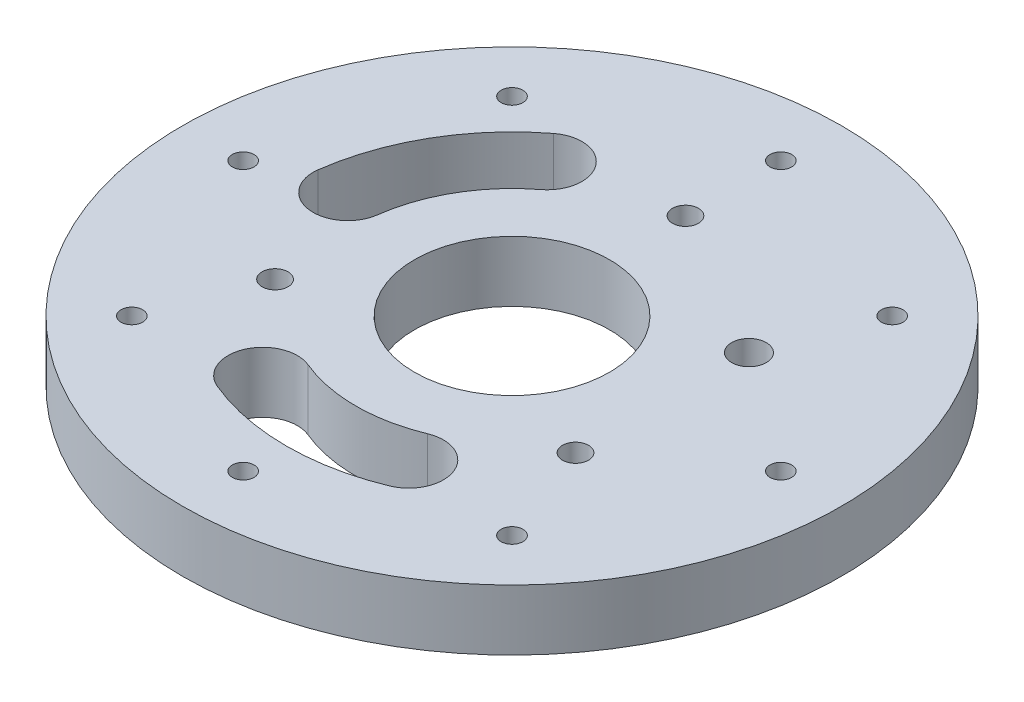
ISO-10303-21;
HEADER;
FILE_DESCRIPTION(('STEP AP214'),'2;1');
FILE_NAME('part.step','',(''),(''),'','','');
FILE_SCHEMA(('AUTOMOTIVE_DESIGN { 1 0 10303 214 1 1 1 1 }'));
ENDSEC;
DATA;
#1=APPLICATION_CONTEXT('core data for automotive mechanical design processes');
#2=APPLICATION_PROTOCOL_DEFINITION('international standard','automotive_design',2000,#1);
#3=PRODUCT_CONTEXT('',#1,'mechanical');
#4=PRODUCT('Part','Part','',(#3));
#5=PRODUCT_RELATED_PRODUCT_CATEGORY('part','',(#4));
#6=PRODUCT_DEFINITION_FORMATION('','',#4);
#7=PRODUCT_DEFINITION_CONTEXT('part definition',#1,'design');
#8=PRODUCT_DEFINITION('design','',#6,#7);
#9=PRODUCT_DEFINITION_SHAPE('','',#8);
#10=(LENGTH_UNIT() NAMED_UNIT(*) SI_UNIT(.MILLI.,.METRE.));
#11=(NAMED_UNIT(*) PLANE_ANGLE_UNIT() SI_UNIT($,.RADIAN.));
#12=(NAMED_UNIT(*) SI_UNIT($,.STERADIAN.) SOLID_ANGLE_UNIT());
#13=UNCERTAINTY_MEASURE_WITH_UNIT(LENGTH_MEASURE(1.E-05),#10,'distance_accuracy_value','');
#14=(GEOMETRIC_REPRESENTATION_CONTEXT(3) GLOBAL_UNCERTAINTY_ASSIGNED_CONTEXT((#13)) GLOBAL_UNIT_ASSIGNED_CONTEXT((#10,
#11,#12)) REPRESENTATION_CONTEXT('',''));
#15=CARTESIAN_POINT('',(0.,0.,0.));
#16=DIRECTION('',(0.,0.,1.));
#17=DIRECTION('',(1.,0.,0.));
#18=AXIS2_PLACEMENT_3D('',#15,#16,#17);
#19=CARTESIAN_POINT('',(0.,0.,0.));
#20=DIRECTION('',(0.,1.,0.));
#21=DIRECTION('',(0.,0.,1.));
#22=AXIS2_PLACEMENT_3D('',#19,#20,#21);
#23=PLANE('',#22);
#24=CARTESIAN_POINT('',(0.,0.,0.));
#25=DIRECTION('',(0.,1.,0.));
#26=DIRECTION('',(0.,0.,1.));
#27=AXIS2_PLACEMENT_3D('',#24,#25,#26);
#28=CIRCLE('',#27,11.25);
#29=CARTESIAN_POINT('',(0.,0.,11.25));
#30=VERTEX_POINT('',#29);
#31=EDGE_CURVE('E225',#30,#30,#28,.T.);
#32=ORIENTED_EDGE('',*,*,#31,.T.);
#33=EDGE_LOOP('',(#32));
#34=FACE_BOUND('',#33,.T.);
#35=CARTESIAN_POINT('',(0.,0.,0.));
#36=DIRECTION('',(0.,1.,0.));
#37=DIRECTION('',(0.,0.,1.));
#38=AXIS2_PLACEMENT_3D('',#35,#36,#37);
#39=CIRCLE('',#38,38.);
#40=CARTESIAN_POINT('',(0.,0.,38.));
#41=VERTEX_POINT('',#40);
#42=EDGE_CURVE('E12',#41,#41,#39,.T.);
#43=ORIENTED_EDGE('',*,*,#42,.F.);
#44=EDGE_LOOP('',(#43));
#45=FACE_BOUND('',#44,.T.);
#46=CARTESIAN_POINT('',(0.,0.,-20.));
#47=DIRECTION('',(0.,1.,0.));
#48=DIRECTION('',(0.,0.,1.));
#49=AXIS2_PLACEMENT_3D('',#46,#47,#48);
#50=CIRCLE('',#49,1.5);
#51=CARTESIAN_POINT('',(0.,0.,-18.5));
#52=VERTEX_POINT('',#51);
#53=EDGE_CURVE('E472',#52,#52,#50,.T.);
#54=ORIENTED_EDGE('',*,*,#53,.T.);
#55=EDGE_LOOP('',(#54));
#56=FACE_BOUND('',#55,.T.);
#57=CARTESIAN_POINT('',(17.3205080756887,0.,-10.0000000000001));
#58=DIRECTION('',(0.,1.,0.));
#59=DIRECTION('',(0.,0.,1.));
#60=AXIS2_PLACEMENT_3D('',#57,#58,#59);
#61=CIRCLE('',#60,2.);
#62=CARTESIAN_POINT('',(17.3205080756887,0.,-8.00000000000009));
#63=VERTEX_POINT('',#62);
#64=EDGE_CURVE('E470',#63,#63,#61,.T.);
#65=ORIENTED_EDGE('',*,*,#64,.T.);
#66=EDGE_LOOP('',(#65));
#67=FACE_BOUND('',#66,.T.);
#68=CARTESIAN_POINT('',(17.3205080756888,0.,9.99999999999999));
#69=DIRECTION('',(0.,1.,0.));
#70=DIRECTION('',(0.,0.,1.));
#71=AXIS2_PLACEMENT_3D('',#68,#69,#70);
#72=CIRCLE('',#71,1.5);
#73=CARTESIAN_POINT('',(17.3205080756888,0.,11.5));
#74=VERTEX_POINT('',#73);
#75=EDGE_CURVE('E462',#74,#74,#72,.T.);
#76=ORIENTED_EDGE('',*,*,#75,.T.);
#77=EDGE_LOOP('',(#76));
#78=FACE_BOUND('',#77,.T.);
#79=CARTESIAN_POINT('',(-17.3205080756888,0.,10.));
#80=DIRECTION('',(0.,1.,0.));
#81=DIRECTION('',(0.,0.,1.));
#82=AXIS2_PLACEMENT_3D('',#79,#80,#81);
#83=CIRCLE('',#82,1.5);
#84=CARTESIAN_POINT('',(-17.3205080756888,0.,11.5));
#85=VERTEX_POINT('',#84);
#86=EDGE_CURVE('E457',#85,#85,#83,.T.);
#87=ORIENTED_EDGE('',*,*,#86,.T.);
#88=EDGE_LOOP('',(#87));
#89=FACE_BOUND('',#88,.T.);
#90=CARTESIAN_POINT('',(21.920310216783,0.,21.920310216783));
#91=DIRECTION('',(0.,-1.,0.));
#92=DIRECTION('',(0.,0.,-1.));
#93=AXIS2_PLACEMENT_3D('',#90,#91,#92);
#94=CIRCLE('',#93,1.25);
#95=CARTESIAN_POINT('',(21.920310216783,0.,20.670310216783));
#96=VERTEX_POINT('',#95);
#97=EDGE_CURVE('E323',#96,#96,#94,.T.);
#98=ORIENTED_EDGE('',*,*,#97,.F.);
#99=EDGE_LOOP('',(#98));
#100=FACE_BOUND('',#99,.T.);
#101=CARTESIAN_POINT('',(31.,0.,0.));
#102=DIRECTION('',(0.,-1.,0.));
#103=DIRECTION('',(0.,0.,-1.));
#104=AXIS2_PLACEMENT_3D('',#101,#102,#103);
#105=CIRCLE('',#104,1.25);
#106=CARTESIAN_POINT('',(31.,0.,-1.25000000000001));
#107=VERTEX_POINT('',#106);
#108=EDGE_CURVE('E400',#107,#107,#105,.T.);
#109=ORIENTED_EDGE('',*,*,#108,.F.);
#110=EDGE_LOOP('',(#109));
#111=FACE_BOUND('',#110,.T.);
#112=CARTESIAN_POINT('',(21.920310216783,0.,-21.920310216783));
#113=DIRECTION('',(0.,-1.,0.));
#114=DIRECTION('',(0.,0.,-1.));
#115=AXIS2_PLACEMENT_3D('',#112,#113,#114);
#116=CIRCLE('',#115,1.25);
#117=CARTESIAN_POINT('',(21.920310216783,0.,-23.170310216783));
#118=VERTEX_POINT('',#117);
#119=EDGE_CURVE('E391',#118,#118,#116,.T.);
#120=ORIENTED_EDGE('',*,*,#119,.F.);
#121=EDGE_LOOP('',(#120));
#122=FACE_BOUND('',#121,.T.);
#123=CARTESIAN_POINT('',(0.,0.,-31.));
#124=DIRECTION('',(0.,-1.,0.));
#125=DIRECTION('',(0.,0.,-1.));
#126=AXIS2_PLACEMENT_3D('',#123,#124,#125);
#127=CIRCLE('',#126,1.25);
#128=CARTESIAN_POINT('',(0.,0.,-32.25));
#129=VERTEX_POINT('',#128);
#130=EDGE_CURVE('E388',#129,#129,#127,.T.);
#131=ORIENTED_EDGE('',*,*,#130,.F.);
#132=EDGE_LOOP('',(#131));
#133=FACE_BOUND('',#132,.T.);
#134=CARTESIAN_POINT('',(-21.920310216783,0.,-21.920310216783));
#135=DIRECTION('',(0.,-1.,0.));
#136=DIRECTION('',(0.,0.,-1.));
#137=AXIS2_PLACEMENT_3D('',#134,#135,#136);
#138=CIRCLE('',#137,1.25);
#139=CARTESIAN_POINT('',(-21.920310216783,0.,-23.170310216783));
#140=VERTEX_POINT('',#139);
#141=EDGE_CURVE('E387',#140,#140,#138,.T.);
#142=ORIENTED_EDGE('',*,*,#141,.F.);
#143=EDGE_LOOP('',(#142));
#144=FACE_BOUND('',#143,.T.);
#145=CARTESIAN_POINT('',(-31.,0.,0.));
#146=DIRECTION('',(0.,-1.,0.));
#147=DIRECTION('',(0.,0.,-1.));
#148=AXIS2_PLACEMENT_3D('',#145,#146,#147);
#149=CIRCLE('',#148,1.25);
#150=CARTESIAN_POINT('',(-31.,0.,-1.24999999999999));
#151=VERTEX_POINT('',#150);
#152=EDGE_CURVE('E385',#151,#151,#149,.T.);
#153=ORIENTED_EDGE('',*,*,#152,.F.);
#154=EDGE_LOOP('',(#153));
#155=FACE_BOUND('',#154,.T.);
#156=CARTESIAN_POINT('',(-21.920310216783,0.,21.920310216783));
#157=DIRECTION('',(0.,-1.,0.));
#158=DIRECTION('',(0.,0.,-1.));
#159=AXIS2_PLACEMENT_3D('',#156,#157,#158);
#160=CIRCLE('',#159,1.25);
#161=CARTESIAN_POINT('',(-21.920310216783,0.,20.670310216783));
#162=VERTEX_POINT('',#161);
#163=EDGE_CURVE('E377',#162,#162,#160,.T.);
#164=ORIENTED_EDGE('',*,*,#163,.F.);
#165=EDGE_LOOP('',(#164));
#166=FACE_BOUND('',#165,.T.);
#167=CARTESIAN_POINT('',(0.,0.,31.));
#168=DIRECTION('',(0.,-1.,0.));
#169=DIRECTION('',(0.,0.,-1.));
#170=AXIS2_PLACEMENT_3D('',#167,#168,#169);
#171=CIRCLE('',#170,1.25);
#172=CARTESIAN_POINT('',(0.,0.,29.75));
#173=VERTEX_POINT('',#172);
#174=EDGE_CURVE('E373',#173,#173,#171,.T.);
#175=ORIENTED_EDGE('',*,*,#174,.F.);
#176=EDGE_LOOP('',(#175));
#177=FACE_BOUND('',#176,.T.);
#178=CARTESIAN_POINT('',(0.,0.,0.));
#179=DIRECTION('',(0.,1.,0.));
#180=DIRECTION('',(0.,0.,1.));
#181=AXIS2_PLACEMENT_3D('',#178,#179,#180);
#182=CIRCLE('',#181,18.);
#183=CARTESIAN_POINT('',(-10.957705722157,0.,-14.2803601252422));
#184=VERTEX_POINT('',#183);
#185=CARTESIAN_POINT('',(-17.8460075047286,0.,-2.34947145996091));
#186=VERTEX_POINT('',#185);
#187=EDGE_CURVE('E352',#184,#186,#182,.T.);
#188=ORIENTED_EDGE('',*,*,#187,.F.);
#189=CARTESIAN_POINT('',(-13.3927514381919,0.,-17.4537734864072));
#190=DIRECTION('',(0.,-1.,0.));
#191=DIRECTION('',(0.,0.,1.));
#192=AXIS2_PLACEMENT_3D('',#189,#190,#191);
#193=CIRCLE('',#192,4.);
#194=CARTESIAN_POINT('',(-15.8277971542267,0.,-20.6271868475721));
#195=VERTEX_POINT('',#194);
#196=EDGE_CURVE('E240',#195,#184,#193,.T.);
#197=ORIENTED_EDGE('',*,*,#196,.F.);
#198=CARTESIAN_POINT('',(0.,0.,0.));
#199=DIRECTION('',(0.,-1.,0.));
#200=DIRECTION('',(0.,0.,1.));
#201=AXIS2_PLACEMENT_3D('',#198,#199,#200);
#202=CIRCLE('',#201,26.);
#203=CARTESIAN_POINT('',(-25.7775663957191,0.,-3.39368099772132));
#204=VERTEX_POINT('',#203);
#205=EDGE_CURVE('E341',#204,#195,#202,.T.);
#206=ORIENTED_EDGE('',*,*,#205,.F.);
#207=CARTESIAN_POINT('',(-21.8117869502238,0.,-2.87157622884111));
#208=DIRECTION('',(0.,-1.,0.));
#209=DIRECTION('',(0.,0.,1.));
#210=AXIS2_PLACEMENT_3D('',#207,#208,#209);
#211=CIRCLE('',#210,4.);
#212=EDGE_CURVE('E346',#186,#204,#211,.T.);
#213=ORIENTED_EDGE('',*,*,#212,.F.);
#214=EDGE_LOOP('',(#188,#197,#206,#213));
#215=FACE_BOUND('',#214,.T.);
#216=CARTESIAN_POINT('',(0.,0.,0.));
#217=DIRECTION('',(0.,-1.,0.));
#218=DIRECTION('',(0.,0.,-1.));
#219=AXIS2_PLACEMENT_3D('',#216,#217,#218);
#220=CIRCLE('',#219,26.);
#221=CARTESIAN_POINT('',(9.94976924149235,0.,24.0208678452935));
#222=VERTEX_POINT('',#221);
#223=CARTESIAN_POINT('',(-9.94976924149234,0.,24.0208678452935));
#224=VERTEX_POINT('',#223);
#225=EDGE_CURVE('E317',#222,#224,#220,.T.);
#226=ORIENTED_EDGE('',*,*,#225,.F.);
#227=CARTESIAN_POINT('',(8.41903551203199,0.,20.3253497152483));
#228=DIRECTION('',(0.,-1.,0.));
#229=DIRECTION('',(0.,0.,-1.));
#230=AXIS2_PLACEMENT_3D('',#227,#228,#229);
#231=CIRCLE('',#230,4.);
#232=CARTESIAN_POINT('',(6.88830178257163,0.,16.6298315852032));
#233=VERTEX_POINT('',#232);
#234=EDGE_CURVE('E230',#233,#222,#231,.T.);
#235=ORIENTED_EDGE('',*,*,#234,.F.);
#236=CARTESIAN_POINT('',(0.,0.,0.));
#237=DIRECTION('',(0.,1.,0.));
#238=DIRECTION('',(0.,0.,-1.));
#239=AXIS2_PLACEMENT_3D('',#236,#237,#238);
#240=CIRCLE('',#239,18.);
#241=CARTESIAN_POINT('',(-6.88830178257163,0.,16.6298315852032));
#242=VERTEX_POINT('',#241);
#243=EDGE_CURVE('E305',#242,#233,#240,.T.);
#244=ORIENTED_EDGE('',*,*,#243,.F.);
#245=CARTESIAN_POINT('',(-8.41903551203199,0.,20.3253497152483));
#246=DIRECTION('',(0.,-1.,0.));
#247=DIRECTION('',(0.,0.,-1.));
#248=AXIS2_PLACEMENT_3D('',#245,#246,#247);
#249=CIRCLE('',#248,4.);
#250=EDGE_CURVE('E308',#224,#242,#249,.T.);
#251=ORIENTED_EDGE('',*,*,#250,.F.);
#252=EDGE_LOOP('',(#226,#235,#244,#251));
#253=FACE_BOUND('',#252,.T.);
#254=ADVANCED_FACE('F214',(#34,#45,#56,#67,#78,#89,#100,#111,#122,#133,#144,#155,#166,#177,#215,
#253),#23,.F.);
#255=CARTESIAN_POINT('',(0.,7.,0.));
#256=DIRECTION('',(0.,1.,0.));
#257=DIRECTION('',(0.,0.,1.));
#258=AXIS2_PLACEMENT_3D('',#255,#256,#257);
#259=PLANE('',#258);
#260=CARTESIAN_POINT('',(-13.3927514381919,7.,-17.4537734864072));
#261=DIRECTION('',(0.,-1.,0.));
#262=DIRECTION('',(0.,0.,1.));
#263=AXIS2_PLACEMENT_3D('',#260,#261,#262);
#264=CIRCLE('',#263,4.);
#265=CARTESIAN_POINT('',(-15.8277971542267,7.,-20.6271868475721));
#266=VERTEX_POINT('',#265);
#267=CARTESIAN_POINT('',(-10.957705722157,7.,-14.2803601252422));
#268=VERTEX_POINT('',#267);
#269=EDGE_CURVE('E347',#266,#268,#264,.T.);
#270=ORIENTED_EDGE('',*,*,#269,.T.);
#271=CARTESIAN_POINT('',(0.,7.,0.));
#272=DIRECTION('',(0.,1.,0.));
#273=DIRECTION('',(0.,0.,1.));
#274=AXIS2_PLACEMENT_3D('',#271,#272,#273);
#275=CIRCLE('',#274,18.);
#276=CARTESIAN_POINT('',(-17.8460075047286,7.,-2.34947145996091));
#277=VERTEX_POINT('',#276);
#278=EDGE_CURVE('E366',#268,#277,#275,.T.);
#279=ORIENTED_EDGE('',*,*,#278,.T.);
#280=CARTESIAN_POINT('',(-21.8117869502238,7.,-2.87157622884111));
#281=DIRECTION('',(0.,-1.,0.));
#282=DIRECTION('',(0.,0.,1.));
#283=AXIS2_PLACEMENT_3D('',#280,#281,#282);
#284=CIRCLE('',#283,4.);
#285=CARTESIAN_POINT('',(-25.7775663957191,7.,-3.39368099772132));
#286=VERTEX_POINT('',#285);
#287=EDGE_CURVE('E365',#277,#286,#284,.T.);
#288=ORIENTED_EDGE('',*,*,#287,.T.);
#289=CARTESIAN_POINT('',(0.,7.,0.));
#290=DIRECTION('',(0.,-1.,0.));
#291=DIRECTION('',(0.,0.,1.));
#292=AXIS2_PLACEMENT_3D('',#289,#290,#291);
#293=CIRCLE('',#292,26.);
#294=EDGE_CURVE('E333',#286,#266,#293,.T.);
#295=ORIENTED_EDGE('',*,*,#294,.T.);
#296=EDGE_LOOP('',(#270,#279,#288,#295));
#297=FACE_BOUND('',#296,.T.);
#298=CARTESIAN_POINT('',(-31.,7.,0.));
#299=DIRECTION('',(0.,1.,0.));
#300=DIRECTION('',(0.,0.,1.));
#301=AXIS2_PLACEMENT_3D('',#298,#299,#300);
#302=CIRCLE('',#301,1.25);
#303=CARTESIAN_POINT('',(-31.,7.,1.25000000000001));
#304=VERTEX_POINT('',#303);
#305=EDGE_CURVE('E410',#304,#304,#302,.T.);
#306=ORIENTED_EDGE('',*,*,#305,.F.);
#307=EDGE_LOOP('',(#306));
#308=FACE_BOUND('',#307,.T.);
#309=CARTESIAN_POINT('',(0.,7.,31.));
#310=DIRECTION('',(0.,1.,0.));
#311=DIRECTION('',(0.,0.,1.));
#312=AXIS2_PLACEMENT_3D('',#309,#310,#311);
#313=CIRCLE('',#312,1.25);
#314=CARTESIAN_POINT('',(0.,7.,32.25));
#315=VERTEX_POINT('',#314);
#316=EDGE_CURVE('E414',#315,#315,#313,.T.);
#317=ORIENTED_EDGE('',*,*,#316,.F.);
#318=EDGE_LOOP('',(#317));
#319=FACE_BOUND('',#318,.T.);
#320=CARTESIAN_POINT('',(31.,7.,0.));
#321=DIRECTION('',(0.,1.,0.));
#322=DIRECTION('',(0.,0.,1.));
#323=AXIS2_PLACEMENT_3D('',#320,#321,#322);
#324=CIRCLE('',#323,1.25);
#325=CARTESIAN_POINT('',(31.,7.,1.25));
#326=VERTEX_POINT('',#325);
#327=EDGE_CURVE('E421',#326,#326,#324,.T.);
#328=ORIENTED_EDGE('',*,*,#327,.F.);
#329=EDGE_LOOP('',(#328));
#330=FACE_BOUND('',#329,.T.);
#331=CARTESIAN_POINT('',(0.,7.,-31.));
#332=DIRECTION('',(0.,1.,0.));
#333=DIRECTION('',(0.,0.,1.));
#334=AXIS2_PLACEMENT_3D('',#331,#332,#333);
#335=CIRCLE('',#334,1.25);
#336=CARTESIAN_POINT('',(0.,7.,-29.75));
#337=VERTEX_POINT('',#336);
#338=EDGE_CURVE('E431',#337,#337,#335,.T.);
#339=ORIENTED_EDGE('',*,*,#338,.F.);
#340=EDGE_LOOP('',(#339));
#341=FACE_BOUND('',#340,.T.);
#342=CARTESIAN_POINT('',(-17.3205080756888,7.,10.));
#343=DIRECTION('',(0.,1.,0.));
#344=DIRECTION('',(0.,0.,1.));
#345=AXIS2_PLACEMENT_3D('',#342,#343,#344);
#346=CIRCLE('',#345,1.5);
#347=CARTESIAN_POINT('',(-17.3205080756888,7.,11.5));
#348=VERTEX_POINT('',#347);
#349=EDGE_CURVE('E437',#348,#348,#346,.T.);
#350=ORIENTED_EDGE('',*,*,#349,.F.);
#351=EDGE_LOOP('',(#350));
#352=FACE_BOUND('',#351,.T.);
#353=CARTESIAN_POINT('',(17.3205080756887,7.,-10.0000000000001));
#354=DIRECTION('',(0.,1.,0.));
#355=DIRECTION('',(0.,0.,1.));
#356=AXIS2_PLACEMENT_3D('',#353,#354,#355);
#357=CIRCLE('',#356,2.);
#358=CARTESIAN_POINT('',(17.3205080756887,7.,-8.00000000000009));
#359=VERTEX_POINT('',#358);
#360=EDGE_CURVE('E450',#359,#359,#357,.T.);
#361=ORIENTED_EDGE('',*,*,#360,.F.);
#362=EDGE_LOOP('',(#361));
#363=FACE_BOUND('',#362,.T.);
#364=CARTESIAN_POINT('',(0.,7.,0.));
#365=DIRECTION('',(0.,1.,0.));
#366=DIRECTION('',(0.,0.,1.));
#367=AXIS2_PLACEMENT_3D('',#364,#365,#366);
#368=CIRCLE('',#367,38.);
#369=CARTESIAN_POINT('',(0.,7.,38.));
#370=VERTEX_POINT('',#369);
#371=EDGE_CURVE('E453',#370,#370,#368,.T.);
#372=ORIENTED_EDGE('',*,*,#371,.T.);
#373=EDGE_LOOP('',(#372));
#374=FACE_BOUND('',#373,.T.);
#375=CARTESIAN_POINT('',(0.,7.,0.));
#376=DIRECTION('',(0.,1.,0.));
#377=DIRECTION('',(0.,0.,1.));
#378=AXIS2_PLACEMENT_3D('',#375,#376,#377);
#379=CIRCLE('',#378,11.25);
#380=CARTESIAN_POINT('',(0.,7.,11.25));
#381=VERTEX_POINT('',#380);
#382=EDGE_CURVE('E452',#381,#381,#379,.T.);
#383=ORIENTED_EDGE('',*,*,#382,.F.);
#384=EDGE_LOOP('',(#383));
#385=FACE_BOUND('',#384,.T.);
#386=CARTESIAN_POINT('',(17.3205080756888,7.,9.99999999999999));
#387=DIRECTION('',(0.,1.,0.));
#388=DIRECTION('',(0.,0.,1.));
#389=AXIS2_PLACEMENT_3D('',#386,#387,#388);
#390=CIRCLE('',#389,1.5);
#391=CARTESIAN_POINT('',(17.3205080756888,7.,11.5));
#392=VERTEX_POINT('',#391);
#393=EDGE_CURVE('E442',#392,#392,#390,.T.);
#394=ORIENTED_EDGE('',*,*,#393,.F.);
#395=EDGE_LOOP('',(#394));
#396=FACE_BOUND('',#395,.T.);
#397=CARTESIAN_POINT('',(0.,7.,-20.));
#398=DIRECTION('',(0.,1.,0.));
#399=DIRECTION('',(0.,0.,1.));
#400=AXIS2_PLACEMENT_3D('',#397,#398,#399);
#401=CIRCLE('',#400,1.5);
#402=CARTESIAN_POINT('',(0.,7.,-18.5));
#403=VERTEX_POINT('',#402);
#404=EDGE_CURVE('E434',#403,#403,#401,.T.);
#405=ORIENTED_EDGE('',*,*,#404,.F.);
#406=EDGE_LOOP('',(#405));
#407=FACE_BOUND('',#406,.T.);
#408=CARTESIAN_POINT('',(21.920310216783,7.,-21.920310216783));
#409=DIRECTION('',(0.,1.,0.));
#410=DIRECTION('',(0.,0.,1.));
#411=AXIS2_PLACEMENT_3D('',#408,#409,#410);
#412=CIRCLE('',#411,1.25);
#413=CARTESIAN_POINT('',(21.920310216783,7.,-20.670310216783));
#414=VERTEX_POINT('',#413);
#415=EDGE_CURVE('E430',#414,#414,#412,.T.);
#416=ORIENTED_EDGE('',*,*,#415,.F.);
#417=EDGE_LOOP('',(#416));
#418=FACE_BOUND('',#417,.T.);
#419=CARTESIAN_POINT('',(21.920310216783,7.,21.920310216783));
#420=DIRECTION('',(0.,1.,0.));
#421=DIRECTION('',(0.,0.,1.));
#422=AXIS2_PLACEMENT_3D('',#419,#420,#421);
#423=CIRCLE('',#422,1.25);
#424=CARTESIAN_POINT('',(21.920310216783,7.,23.170310216783));
#425=VERTEX_POINT('',#424);
#426=EDGE_CURVE('E418',#425,#425,#423,.T.);
#427=ORIENTED_EDGE('',*,*,#426,.F.);
#428=EDGE_LOOP('',(#427));
#429=FACE_BOUND('',#428,.T.);
#430=CARTESIAN_POINT('',(-21.920310216783,7.,21.920310216783));
#431=DIRECTION('',(0.,1.,0.));
#432=DIRECTION('',(0.,0.,1.));
#433=AXIS2_PLACEMENT_3D('',#430,#431,#432);
#434=CIRCLE('',#433,1.25);
#435=CARTESIAN_POINT('',(-21.920310216783,7.,23.170310216783));
#436=VERTEX_POINT('',#435);
#437=EDGE_CURVE('E413',#436,#436,#434,.T.);
#438=ORIENTED_EDGE('',*,*,#437,.F.);
#439=EDGE_LOOP('',(#438));
#440=FACE_BOUND('',#439,.T.);
#441=CARTESIAN_POINT('',(-21.920310216783,7.,-21.920310216783));
#442=DIRECTION('',(0.,1.,0.));
#443=DIRECTION('',(0.,0.,1.));
#444=AXIS2_PLACEMENT_3D('',#441,#442,#443);
#445=CIRCLE('',#444,1.25);
#446=CARTESIAN_POINT('',(-21.920310216783,7.,-20.670310216783));
#447=VERTEX_POINT('',#446);
#448=EDGE_CURVE('E380',#447,#447,#445,.T.);
#449=ORIENTED_EDGE('',*,*,#448,.F.);
#450=EDGE_LOOP('',(#449));
#451=FACE_BOUND('',#450,.T.);
#452=CARTESIAN_POINT('',(8.41903551203199,7.,20.3253497152483));
#453=DIRECTION('',(0.,-1.,0.));
#454=DIRECTION('',(0.,0.,-1.));
#455=AXIS2_PLACEMENT_3D('',#452,#453,#454);
#456=CIRCLE('',#455,4.);
#457=CARTESIAN_POINT('',(6.88830178257163,7.,16.6298315852032));
#458=VERTEX_POINT('',#457);
#459=CARTESIAN_POINT('',(9.94976924149235,7.,24.0208678452935));
#460=VERTEX_POINT('',#459);
#461=EDGE_CURVE('E283',#458,#460,#456,.T.);
#462=ORIENTED_EDGE('',*,*,#461,.T.);
#463=CARTESIAN_POINT('',(0.,7.,0.));
#464=DIRECTION('',(0.,-1.,0.));
#465=DIRECTION('',(0.,0.,-1.));
#466=AXIS2_PLACEMENT_3D('',#463,#464,#465);
#467=CIRCLE('',#466,26.);
#468=CARTESIAN_POINT('',(-9.94976924149234,7.,24.0208678452935));
#469=VERTEX_POINT('',#468);
#470=EDGE_CURVE('E292',#460,#469,#467,.T.);
#471=ORIENTED_EDGE('',*,*,#470,.T.);
#472=CARTESIAN_POINT('',(-8.41903551203199,7.,20.3253497152483));
#473=DIRECTION('',(0.,-1.,0.));
#474=DIRECTION('',(0.,0.,-1.));
#475=AXIS2_PLACEMENT_3D('',#472,#473,#474);
#476=CIRCLE('',#475,4.);
#477=CARTESIAN_POINT('',(-6.88830178257163,7.,16.6298315852032));
#478=VERTEX_POINT('',#477);
#479=EDGE_CURVE('E300',#469,#478,#476,.T.);
#480=ORIENTED_EDGE('',*,*,#479,.T.);
#481=CARTESIAN_POINT('',(0.,7.,0.));
#482=DIRECTION('',(0.,1.,0.));
#483=DIRECTION('',(0.,0.,-1.));
#484=AXIS2_PLACEMENT_3D('',#481,#482,#483);
#485=CIRCLE('',#484,18.);
#486=EDGE_CURVE('E287',#478,#458,#485,.T.);
#487=ORIENTED_EDGE('',*,*,#486,.T.);
#488=EDGE_LOOP('',(#462,#471,#480,#487));
#489=FACE_BOUND('',#488,.T.);
#490=ADVANCED_FACE('F299',(#297,#308,#319,#330,#341,#352,#363,#374,#385,#396,#407,#418,#429,
#440,#451,#489),#259,.T.);
#491=CARTESIAN_POINT('',(0.,4.,0.));
#492=DIRECTION('',(0.,-1.,0.));
#493=DIRECTION('',(0.,0.,-1.));
#494=AXIS2_PLACEMENT_3D('',#491,#492,#493);
#495=CYLINDRICAL_SURFACE('',#494,38.);
#496=ORIENTED_EDGE('',*,*,#42,.T.);
#497=EDGE_LOOP('',(#496));
#498=FACE_BOUND('',#497,.T.);
#499=ORIENTED_EDGE('',*,*,#371,.F.);
#500=EDGE_LOOP('',(#499));
#501=FACE_BOUND('',#500,.T.);
#502=ADVANCED_FACE('F213',(#498,#501),#495,.T.);
#503=CARTESIAN_POINT('',(0.,4.,0.));
#504=DIRECTION('',(0.,-1.,0.));
#505=DIRECTION('',(0.,0.,-1.));
#506=AXIS2_PLACEMENT_3D('',#503,#504,#505);
#507=CYLINDRICAL_SURFACE('',#506,11.25);
#508=ORIENTED_EDGE('',*,*,#31,.F.);
#509=EDGE_LOOP('',(#508));
#510=FACE_BOUND('',#509,.T.);
#511=ORIENTED_EDGE('',*,*,#382,.T.);
#512=EDGE_LOOP('',(#511));
#513=FACE_BOUND('',#512,.T.);
#514=ADVANCED_FACE('F479',(#510,#513),#507,.F.);
#515=CARTESIAN_POINT('',(0.,4.,-20.));
#516=DIRECTION('',(0.,-1.,0.));
#517=DIRECTION('',(0.,0.,-1.));
#518=AXIS2_PLACEMENT_3D('',#515,#516,#517);
#519=CYLINDRICAL_SURFACE('',#518,1.5);
#520=ORIENTED_EDGE('',*,*,#53,.F.);
#521=EDGE_LOOP('',(#520));
#522=FACE_BOUND('',#521,.T.);
#523=ORIENTED_EDGE('',*,*,#404,.T.);
#524=EDGE_LOOP('',(#523));
#525=FACE_BOUND('',#524,.T.);
#526=ADVANCED_FACE('F482',(#522,#525),#519,.F.);
#527=CARTESIAN_POINT('',(17.3205080756887,4.,-10.0000000000001));
#528=DIRECTION('',(0.,-1.,0.));
#529=DIRECTION('',(0.,0.,-1.));
#530=AXIS2_PLACEMENT_3D('',#527,#528,#529);
#531=CYLINDRICAL_SURFACE('',#530,2.);
#532=ORIENTED_EDGE('',*,*,#64,.F.);
#533=EDGE_LOOP('',(#532));
#534=FACE_BOUND('',#533,.T.);
#535=ORIENTED_EDGE('',*,*,#360,.T.);
#536=EDGE_LOOP('',(#535));
#537=FACE_BOUND('',#536,.T.);
#538=ADVANCED_FACE('F588',(#534,#537),#531,.F.);
#539=CARTESIAN_POINT('',(17.3205080756888,4.,9.99999999999999));
#540=DIRECTION('',(0.,-1.,0.));
#541=DIRECTION('',(0.,0.,-1.));
#542=AXIS2_PLACEMENT_3D('',#539,#540,#541);
#543=CYLINDRICAL_SURFACE('',#542,1.5);
#544=ORIENTED_EDGE('',*,*,#75,.F.);
#545=EDGE_LOOP('',(#544));
#546=FACE_BOUND('',#545,.T.);
#547=ORIENTED_EDGE('',*,*,#393,.T.);
#548=EDGE_LOOP('',(#547));
#549=FACE_BOUND('',#548,.T.);
#550=ADVANCED_FACE('F585',(#546,#549),#543,.F.);
#551=CARTESIAN_POINT('',(-17.3205080756888,4.,10.));
#552=DIRECTION('',(0.,-1.,0.));
#553=DIRECTION('',(0.,0.,-1.));
#554=AXIS2_PLACEMENT_3D('',#551,#552,#553);
#555=CYLINDRICAL_SURFACE('',#554,1.5);
#556=ORIENTED_EDGE('',*,*,#86,.F.);
#557=EDGE_LOOP('',(#556));
#558=FACE_BOUND('',#557,.T.);
#559=ORIENTED_EDGE('',*,*,#349,.T.);
#560=EDGE_LOOP('',(#559));
#561=FACE_BOUND('',#560,.T.);
#562=ADVANCED_FACE('F580',(#558,#561),#555,.F.);
#563=CARTESIAN_POINT('',(0.,7.,-31.));
#564=DIRECTION('',(0.,-1.,0.));
#565=DIRECTION('',(0.,0.,-1.));
#566=AXIS2_PLACEMENT_3D('',#563,#564,#565);
#567=CYLINDRICAL_SURFACE('',#566,1.25);
#568=ORIENTED_EDGE('',*,*,#338,.T.);
#569=EDGE_LOOP('',(#568));
#570=FACE_BOUND('',#569,.T.);
#571=ORIENTED_EDGE('',*,*,#130,.T.);
#572=EDGE_LOOP('',(#571));
#573=FACE_BOUND('',#572,.T.);
#574=ADVANCED_FACE('F573',(#570,#573),#567,.F.);
#575=CARTESIAN_POINT('',(21.920310216783,7.,-21.920310216783));
#576=DIRECTION('',(0.,-1.,0.));
#577=DIRECTION('',(0.,0.,-1.));
#578=AXIS2_PLACEMENT_3D('',#575,#576,#577);
#579=CYLINDRICAL_SURFACE('',#578,1.25);
#580=ORIENTED_EDGE('',*,*,#415,.T.);
#581=EDGE_LOOP('',(#580));
#582=FACE_BOUND('',#581,.T.);
#583=ORIENTED_EDGE('',*,*,#119,.T.);
#584=EDGE_LOOP('',(#583));
#585=FACE_BOUND('',#584,.T.);
#586=ADVANCED_FACE('F569',(#582,#585),#579,.F.);
#587=CARTESIAN_POINT('',(31.,7.,0.));
#588=DIRECTION('',(0.,-1.,0.));
#589=DIRECTION('',(0.,0.,-1.));
#590=AXIS2_PLACEMENT_3D('',#587,#588,#589);
#591=CYLINDRICAL_SURFACE('',#590,1.25);
#592=ORIENTED_EDGE('',*,*,#327,.T.);
#593=EDGE_LOOP('',(#592));
#594=FACE_BOUND('',#593,.T.);
#595=ORIENTED_EDGE('',*,*,#108,.T.);
#596=EDGE_LOOP('',(#595));
#597=FACE_BOUND('',#596,.T.);
#598=ADVANCED_FACE('F566',(#594,#597),#591,.F.);
#599=CARTESIAN_POINT('',(21.920310216783,7.,21.920310216783));
#600=DIRECTION('',(0.,-1.,0.));
#601=DIRECTION('',(0.,0.,-1.));
#602=AXIS2_PLACEMENT_3D('',#599,#600,#601);
#603=CYLINDRICAL_SURFACE('',#602,1.25);
#604=ORIENTED_EDGE('',*,*,#426,.T.);
#605=EDGE_LOOP('',(#604));
#606=FACE_BOUND('',#605,.T.);
#607=ORIENTED_EDGE('',*,*,#97,.T.);
#608=EDGE_LOOP('',(#607));
#609=FACE_BOUND('',#608,.T.);
#610=ADVANCED_FACE('F565',(#606,#609),#603,.F.);
#611=CARTESIAN_POINT('',(0.,7.,31.));
#612=DIRECTION('',(0.,-1.,0.));
#613=DIRECTION('',(0.,0.,-1.));
#614=AXIS2_PLACEMENT_3D('',#611,#612,#613);
#615=CYLINDRICAL_SURFACE('',#614,1.25);
#616=ORIENTED_EDGE('',*,*,#316,.T.);
#617=EDGE_LOOP('',(#616));
#618=FACE_BOUND('',#617,.T.);
#619=ORIENTED_EDGE('',*,*,#174,.T.);
#620=EDGE_LOOP('',(#619));
#621=FACE_BOUND('',#620,.T.);
#622=ADVANCED_FACE('F556',(#618,#621),#615,.F.);
#623=CARTESIAN_POINT('',(-21.920310216783,7.,21.920310216783));
#624=DIRECTION('',(0.,-1.,0.));
#625=DIRECTION('',(0.,0.,-1.));
#626=AXIS2_PLACEMENT_3D('',#623,#624,#625);
#627=CYLINDRICAL_SURFACE('',#626,1.25);
#628=ORIENTED_EDGE('',*,*,#437,.T.);
#629=EDGE_LOOP('',(#628));
#630=FACE_BOUND('',#629,.T.);
#631=ORIENTED_EDGE('',*,*,#163,.T.);
#632=EDGE_LOOP('',(#631));
#633=FACE_BOUND('',#632,.T.);
#634=ADVANCED_FACE('F555',(#630,#633),#627,.F.);
#635=CARTESIAN_POINT('',(-31.,7.,0.));
#636=DIRECTION('',(0.,-1.,0.));
#637=DIRECTION('',(0.,0.,-1.));
#638=AXIS2_PLACEMENT_3D('',#635,#636,#637);
#639=CYLINDRICAL_SURFACE('',#638,1.25);
#640=ORIENTED_EDGE('',*,*,#305,.T.);
#641=EDGE_LOOP('',(#640));
#642=FACE_BOUND('',#641,.T.);
#643=ORIENTED_EDGE('',*,*,#152,.T.);
#644=EDGE_LOOP('',(#643));
#645=FACE_BOUND('',#644,.T.);
#646=ADVANCED_FACE('F510',(#642,#645),#639,.F.);
#647=CARTESIAN_POINT('',(-21.920310216783,7.,-21.920310216783));
#648=DIRECTION('',(0.,-1.,0.));
#649=DIRECTION('',(0.,0.,-1.));
#650=AXIS2_PLACEMENT_3D('',#647,#648,#649);
#651=CYLINDRICAL_SURFACE('',#650,1.25);
#652=ORIENTED_EDGE('',*,*,#448,.T.);
#653=EDGE_LOOP('',(#652));
#654=FACE_BOUND('',#653,.T.);
#655=ORIENTED_EDGE('',*,*,#141,.T.);
#656=EDGE_LOOP('',(#655));
#657=FACE_BOUND('',#656,.T.);
#658=ADVANCED_FACE('F503',(#654,#657),#651,.F.);
#659=CARTESIAN_POINT('',(-13.3927514381919,7.,-17.4537734864072));
#660=DIRECTION('',(0.,-1.,0.));
#661=DIRECTION('',(0.,0.,-1.));
#662=AXIS2_PLACEMENT_3D('',#659,#660,#661);
#663=CYLINDRICAL_SURFACE('',#662,4.);
#664=ORIENTED_EDGE('',*,*,#196,.T.);
#665=DIRECTION('',(0.,-1.,0.));
#666=VECTOR('',#665,1.);
#667=CARTESIAN_POINT('',(-10.957705722157,7.,-14.2803601252422));
#668=LINE('',#667,#666);
#669=EDGE_CURVE('E331',#268,#184,#668,.T.);
#670=ORIENTED_EDGE('',*,*,#669,.F.);
#671=ORIENTED_EDGE('',*,*,#269,.F.);
#672=DIRECTION('',(0.,-1.,0.));
#673=VECTOR('',#672,1.);
#674=CARTESIAN_POINT('',(-15.8277971542267,7.,-20.6271868475721));
#675=LINE('',#674,#673);
#676=EDGE_CURVE('E342',#266,#195,#675,.T.);
#677=ORIENTED_EDGE('',*,*,#676,.T.);
#678=EDGE_LOOP('',(#664,#670,#671,#677));
#679=FACE_BOUND('',#678,.T.);
#680=ADVANCED_FACE('F506',(#679),#663,.F.);
#681=CARTESIAN_POINT('',(0.,7.,0.));
#682=DIRECTION('',(0.,-1.,0.));
#683=DIRECTION('',(0.,0.,-1.));
#684=AXIS2_PLACEMENT_3D('',#681,#682,#683);
#685=CYLINDRICAL_SURFACE('',#684,26.);
#686=ORIENTED_EDGE('',*,*,#205,.T.);
#687=ORIENTED_EDGE('',*,*,#676,.F.);
#688=ORIENTED_EDGE('',*,*,#294,.F.);
#689=DIRECTION('',(0.,-1.,0.));
#690=VECTOR('',#689,1.);
#691=CARTESIAN_POINT('',(-25.7775663957191,7.,-3.39368099772132));
#692=LINE('',#691,#690);
#693=EDGE_CURVE('E336',#286,#204,#692,.T.);
#694=ORIENTED_EDGE('',*,*,#693,.T.);
#695=EDGE_LOOP('',(#686,#687,#688,#694));
#696=FACE_BOUND('',#695,.T.);
#697=ADVANCED_FACE('F543',(#696),#685,.F.);
#698=CARTESIAN_POINT('',(-21.8117869502238,7.,-2.87157622884111));
#699=DIRECTION('',(0.,-1.,0.));
#700=DIRECTION('',(0.,0.,-1.));
#701=AXIS2_PLACEMENT_3D('',#698,#699,#700);
#702=CYLINDRICAL_SURFACE('',#701,4.);
#703=ORIENTED_EDGE('',*,*,#212,.T.);
#704=ORIENTED_EDGE('',*,*,#693,.F.);
#705=ORIENTED_EDGE('',*,*,#287,.F.);
#706=DIRECTION('',(0.,-1.,0.));
#707=VECTOR('',#706,1.);
#708=CARTESIAN_POINT('',(-17.8460075047286,7.,-2.34947145996091));
#709=LINE('',#708,#707);
#710=EDGE_CURVE('E334',#277,#186,#709,.T.);
#711=ORIENTED_EDGE('',*,*,#710,.T.);
#712=EDGE_LOOP('',(#703,#704,#705,#711));
#713=FACE_BOUND('',#712,.T.);
#714=ADVANCED_FACE('F542',(#713),#702,.F.);
#715=CARTESIAN_POINT('',(0.,7.,0.));
#716=DIRECTION('',(0.,-1.,0.));
#717=DIRECTION('',(0.,0.,-1.));
#718=AXIS2_PLACEMENT_3D('',#715,#716,#717);
#719=CYLINDRICAL_SURFACE('',#718,18.);
#720=ORIENTED_EDGE('',*,*,#187,.T.);
#721=ORIENTED_EDGE('',*,*,#710,.F.);
#722=ORIENTED_EDGE('',*,*,#278,.F.);
#723=ORIENTED_EDGE('',*,*,#669,.T.);
#724=EDGE_LOOP('',(#720,#721,#722,#723));
#725=FACE_BOUND('',#724,.T.);
#726=ADVANCED_FACE('F534',(#725),#719,.T.);
#727=CARTESIAN_POINT('',(8.41903551203199,7.,20.3253497152483));
#728=DIRECTION('',(0.,-1.,0.));
#729=DIRECTION('',(0.,0.,-1.));
#730=AXIS2_PLACEMENT_3D('',#727,#728,#729);
#731=CYLINDRICAL_SURFACE('',#730,4.);
#732=ORIENTED_EDGE('',*,*,#234,.T.);
#733=DIRECTION('',(0.,-1.,0.));
#734=VECTOR('',#733,1.);
#735=CARTESIAN_POINT('',(9.94976924149235,7.,24.0208678452935));
#736=LINE('',#735,#734);
#737=EDGE_CURVE('E280',#460,#222,#736,.T.);
#738=ORIENTED_EDGE('',*,*,#737,.F.);
#739=ORIENTED_EDGE('',*,*,#461,.F.);
#740=DIRECTION('',(0.,-1.,0.));
#741=VECTOR('',#740,1.);
#742=CARTESIAN_POINT('',(6.88830178257163,7.,16.6298315852032));
#743=LINE('',#742,#741);
#744=EDGE_CURVE('E325',#458,#233,#743,.T.);
#745=ORIENTED_EDGE('',*,*,#744,.T.);
#746=EDGE_LOOP('',(#732,#738,#739,#745));
#747=FACE_BOUND('',#746,.T.);
#748=ADVANCED_FACE('F276',(#747),#731,.F.);
#749=CARTESIAN_POINT('',(0.,7.,0.));
#750=DIRECTION('',(0.,-1.,0.));
#751=DIRECTION('',(0.,0.,-1.));
#752=AXIS2_PLACEMENT_3D('',#749,#750,#751);
#753=CYLINDRICAL_SURFACE('',#752,18.);
#754=ORIENTED_EDGE('',*,*,#243,.T.);
#755=ORIENTED_EDGE('',*,*,#744,.F.);
#756=ORIENTED_EDGE('',*,*,#486,.F.);
#757=DIRECTION('',(0.,-1.,0.));
#758=VECTOR('',#757,1.);
#759=CARTESIAN_POINT('',(-6.88830178257163,7.,16.6298315852032));
#760=LINE('',#759,#758);
#761=EDGE_CURVE('E328',#478,#242,#760,.T.);
#762=ORIENTED_EDGE('',*,*,#761,.T.);
#763=EDGE_LOOP('',(#754,#755,#756,#762));
#764=FACE_BOUND('',#763,.T.);
#765=ADVANCED_FACE('F530',(#764),#753,.T.);
#766=CARTESIAN_POINT('',(-8.41903551203199,7.,20.3253497152483));
#767=DIRECTION('',(0.,-1.,0.));
#768=DIRECTION('',(0.,0.,-1.));
#769=AXIS2_PLACEMENT_3D('',#766,#767,#768);
#770=CYLINDRICAL_SURFACE('',#769,4.);
#771=ORIENTED_EDGE('',*,*,#250,.T.);
#772=ORIENTED_EDGE('',*,*,#761,.F.);
#773=ORIENTED_EDGE('',*,*,#479,.F.);
#774=DIRECTION('',(0.,-1.,0.));
#775=VECTOR('',#774,1.);
#776=CARTESIAN_POINT('',(-9.94976924149234,7.,24.0208678452935));
#777=LINE('',#776,#775);
#778=EDGE_CURVE('E290',#469,#224,#777,.T.);
#779=ORIENTED_EDGE('',*,*,#778,.T.);
#780=EDGE_LOOP('',(#771,#772,#773,#779));
#781=FACE_BOUND('',#780,.T.);
#782=ADVANCED_FACE('F524',(#781),#770,.F.);
#783=CARTESIAN_POINT('',(0.,7.,0.));
#784=DIRECTION('',(0.,-1.,0.));
#785=DIRECTION('',(0.,0.,-1.));
#786=AXIS2_PLACEMENT_3D('',#783,#784,#785);
#787=CYLINDRICAL_SURFACE('',#786,26.);
#788=ORIENTED_EDGE('',*,*,#225,.T.);
#789=ORIENTED_EDGE('',*,*,#778,.F.);
#790=ORIENTED_EDGE('',*,*,#470,.F.);
#791=ORIENTED_EDGE('',*,*,#737,.T.);
#792=EDGE_LOOP('',(#788,#789,#790,#791));
#793=FACE_BOUND('',#792,.T.);
#794=ADVANCED_FACE('F291',(#793),#787,.F.);
#795=CLOSED_SHELL('',(#254,#490,#502,#514,#526,#538,#550,#562,#574,#586,#598,#610,#622,#634,
#646,#658,#680,#697,#714,#726,#748,#765,#782,#794));
#796=MANIFOLD_SOLID_BREP('B2',#795);
#797=ADVANCED_BREP_SHAPE_REPRESENTATION('',(#18,#796),#14);
#798=SHAPE_DEFINITION_REPRESENTATION(#9,#797);
ENDSEC;
END-ISO-10303-21;
